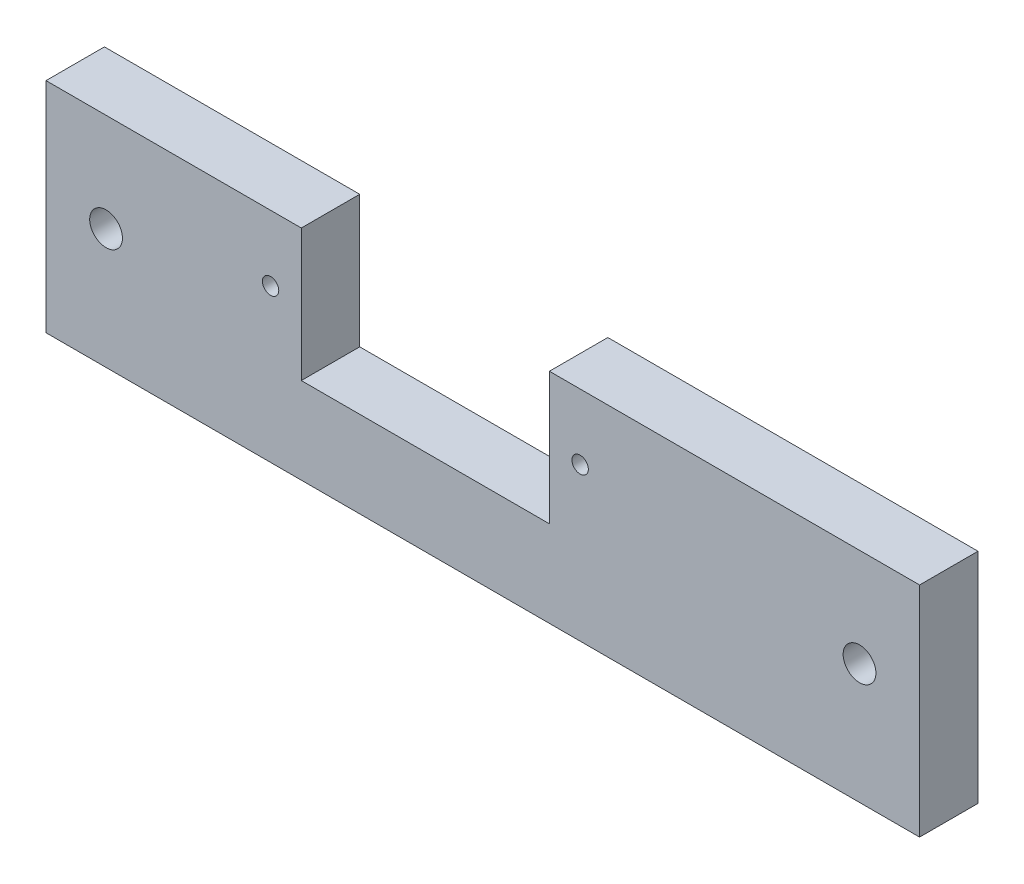
ISO-10303-21;
HEADER;
FILE_DESCRIPTION(('STEP AP214'),'2;1');
FILE_NAME('part.step','',(''),(''),'','','');
FILE_SCHEMA(('AUTOMOTIVE_DESIGN { 1 0 10303 214 1 1 1 1 }'));
ENDSEC;
DATA;
#1=APPLICATION_CONTEXT('core data for automotive mechanical design processes');
#2=APPLICATION_PROTOCOL_DEFINITION('international standard','automotive_design',2000,#1);
#3=PRODUCT_CONTEXT('',#1,'mechanical');
#4=PRODUCT('Part','Part','',(#3));
#5=PRODUCT_RELATED_PRODUCT_CATEGORY('part','',(#4));
#6=PRODUCT_DEFINITION_FORMATION('','',#4);
#7=PRODUCT_DEFINITION_CONTEXT('part definition',#1,'design');
#8=PRODUCT_DEFINITION('design','',#6,#7);
#9=PRODUCT_DEFINITION_SHAPE('','',#8);
#10=(LENGTH_UNIT() NAMED_UNIT(*) SI_UNIT(.MILLI.,.METRE.));
#11=(NAMED_UNIT(*) PLANE_ANGLE_UNIT() SI_UNIT($,.RADIAN.));
#12=(NAMED_UNIT(*) SI_UNIT($,.STERADIAN.) SOLID_ANGLE_UNIT());
#13=UNCERTAINTY_MEASURE_WITH_UNIT(LENGTH_MEASURE(1.E-05),#10,'distance_accuracy_value','');
#14=(GEOMETRIC_REPRESENTATION_CONTEXT(3) GLOBAL_UNCERTAINTY_ASSIGNED_CONTEXT((#13)) GLOBAL_UNIT_ASSIGNED_CONTEXT((#10,
#11,#12)) REPRESENTATION_CONTEXT('',''));
#15=CARTESIAN_POINT('',(0.,0.,0.));
#16=DIRECTION('',(0.,0.,1.));
#17=DIRECTION('',(1.,0.,0.));
#18=AXIS2_PLACEMENT_3D('',#15,#16,#17);
#19=CARTESIAN_POINT('',(0.,19.9999995529,5.35));
#20=DIRECTION('',(0.,1.,0.));
#21=DIRECTION('',(0.,0.,1.));
#22=AXIS2_PLACEMENT_3D('',#19,#20,#21);
#23=PLANE('',#22);
#24=DIRECTION('',(1.,0.,0.));
#25=VECTOR('',#24,1.);
#26=CARTESIAN_POINT('',(0.,19.9999995529,0.));
#27=LINE('',#26,#25);
#28=CARTESIAN_POINT('',(0.,19.9999995529,0.));
#29=VERTEX_POINT('',#28);
#30=CARTESIAN_POINT('',(23.3799982816,19.9999995529,0.));
#31=VERTEX_POINT('',#30);
#32=EDGE_CURVE('E151',#29,#31,#27,.T.);
#33=ORIENTED_EDGE('',*,*,#32,.F.);
#34=DIRECTION('',(0.,0.,-1.));
#35=VECTOR('',#34,1.);
#36=CARTESIAN_POINT('',(0.,19.9999995529,5.35));
#37=LINE('',#36,#35);
#38=CARTESIAN_POINT('',(0.,19.9999995529,5.35));
#39=VERTEX_POINT('',#38);
#40=EDGE_CURVE('E11',#39,#29,#37,.T.);
#41=ORIENTED_EDGE('',*,*,#40,.F.);
#42=DIRECTION('',(1.,0.,0.));
#43=VECTOR('',#42,1.);
#44=CARTESIAN_POINT('',(0.,19.9999995529,5.35));
#45=LINE('',#44,#43);
#46=CARTESIAN_POINT('',(23.3799982816,19.9999995529,5.35));
#47=VERTEX_POINT('',#46);
#48=EDGE_CURVE('E326',#39,#47,#45,.T.);
#49=ORIENTED_EDGE('',*,*,#48,.T.);
#50=DIRECTION('',(0.,0.,-1.));
#51=VECTOR('',#50,1.);
#52=CARTESIAN_POINT('',(23.3799982816,19.9999995529,5.35));
#53=LINE('',#52,#51);
#54=EDGE_CURVE('E86',#47,#31,#53,.T.);
#55=ORIENTED_EDGE('',*,*,#54,.T.);
#56=EDGE_LOOP('',(#33,#41,#49,#55));
#57=FACE_BOUND('',#56,.T.);
#58=ADVANCED_FACE('F35',(#57),#23,.T.);
#59=CARTESIAN_POINT('',(0.,0.,5.35));
#60=DIRECTION('',(-1.,0.,0.));
#61=DIRECTION('',(0.,0.,1.));
#62=AXIS2_PLACEMENT_3D('',#59,#60,#61);
#63=PLANE('',#62);
#64=DIRECTION('',(0.,1.,0.));
#65=VECTOR('',#64,1.);
#66=CARTESIAN_POINT('',(0.,0.,0.));
#67=LINE('',#66,#65);
#68=CARTESIAN_POINT('',(0.,0.,0.));
#69=VERTEX_POINT('',#68);
#70=EDGE_CURVE('E149',#69,#29,#67,.T.);
#71=ORIENTED_EDGE('',*,*,#70,.F.);
#72=DIRECTION('',(0.,0.,-1.));
#73=VECTOR('',#72,1.);
#74=CARTESIAN_POINT('',(0.,0.,5.35));
#75=LINE('',#74,#73);
#76=CARTESIAN_POINT('',(0.,0.,5.35));
#77=VERTEX_POINT('',#76);
#78=EDGE_CURVE('E44',#77,#69,#75,.T.);
#79=ORIENTED_EDGE('',*,*,#78,.F.);
#80=DIRECTION('',(0.,1.,0.));
#81=VECTOR('',#80,1.);
#82=CARTESIAN_POINT('',(0.,0.,5.35));
#83=LINE('',#82,#81);
#84=EDGE_CURVE('E324',#77,#39,#83,.T.);
#85=ORIENTED_EDGE('',*,*,#84,.T.);
#86=ORIENTED_EDGE('',*,*,#40,.T.);
#87=EDGE_LOOP('',(#71,#79,#85,#86));
#88=FACE_BOUND('',#87,.T.);
#89=ADVANCED_FACE('F150',(#88),#63,.T.);
#90=CARTESIAN_POINT('',(0.,0.,5.35));
#91=DIRECTION('',(0.,-1.,0.));
#92=DIRECTION('',(0.,0.,-1.));
#93=AXIS2_PLACEMENT_3D('',#90,#91,#92);
#94=PLANE('',#93);
#95=DIRECTION('',(-1.,0.,0.));
#96=VECTOR('',#95,1.);
#97=CARTESIAN_POINT('',(0.,0.,0.));
#98=LINE('',#97,#96);
#99=CARTESIAN_POINT('',(79.9999982119,0.,0.));
#100=VERTEX_POINT('',#99);
#101=EDGE_CURVE('E141',#100,#69,#98,.T.);
#102=ORIENTED_EDGE('',*,*,#101,.F.);
#103=DIRECTION('',(0.,0.,-1.));
#104=VECTOR('',#103,1.);
#105=CARTESIAN_POINT('',(79.9999982119,0.,5.35));
#106=LINE('',#105,#104);
#107=CARTESIAN_POINT('',(79.9999982119,0.,5.35));
#108=VERTEX_POINT('',#107);
#109=EDGE_CURVE('E134',#108,#100,#106,.T.);
#110=ORIENTED_EDGE('',*,*,#109,.F.);
#111=DIRECTION('',(-1.,0.,0.));
#112=VECTOR('',#111,1.);
#113=CARTESIAN_POINT('',(0.,0.,5.35));
#114=LINE('',#113,#112);
#115=EDGE_CURVE('E144',#108,#77,#114,.T.);
#116=ORIENTED_EDGE('',*,*,#115,.T.);
#117=ORIENTED_EDGE('',*,*,#78,.T.);
#118=EDGE_LOOP('',(#102,#110,#116,#117));
#119=FACE_BOUND('',#118,.T.);
#120=ADVANCED_FACE('F139',(#119),#94,.T.);
#121=CARTESIAN_POINT('',(79.9999982119,0.,5.35));
#122=DIRECTION('',(1.,0.,0.));
#123=DIRECTION('',(0.,0.,-1.));
#124=AXIS2_PLACEMENT_3D('',#121,#122,#123);
#125=PLANE('',#124);
#126=DIRECTION('',(0.,-1.,0.));
#127=VECTOR('',#126,1.);
#128=CARTESIAN_POINT('',(79.9999982119,0.,0.));
#129=LINE('',#128,#127);
#130=CARTESIAN_POINT('',(79.9999982119,19.9999995529,0.));
#131=VERTEX_POINT('',#130);
#132=EDGE_CURVE('E156',#131,#100,#129,.T.);
#133=ORIENTED_EDGE('',*,*,#132,.F.);
#134=DIRECTION('',(0.,0.,-1.));
#135=VECTOR('',#134,1.);
#136=CARTESIAN_POINT('',(79.9999982119,19.9999995529,5.35));
#137=LINE('',#136,#135);
#138=CARTESIAN_POINT('',(79.9999982119,19.9999995529,5.35));
#139=VERTEX_POINT('',#138);
#140=EDGE_CURVE('E128',#139,#131,#137,.T.);
#141=ORIENTED_EDGE('',*,*,#140,.F.);
#142=DIRECTION('',(0.,-1.,0.));
#143=VECTOR('',#142,1.);
#144=CARTESIAN_POINT('',(79.9999982119,0.,5.35));
#145=LINE('',#144,#143);
#146=EDGE_CURVE('E319',#139,#108,#145,.T.);
#147=ORIENTED_EDGE('',*,*,#146,.T.);
#148=ORIENTED_EDGE('',*,*,#109,.T.);
#149=EDGE_LOOP('',(#133,#141,#147,#148));
#150=FACE_BOUND('',#149,.T.);
#151=ADVANCED_FACE('F234',(#150),#125,.T.);
#152=CARTESIAN_POINT('',(0.,19.9999995529,5.35));
#153=DIRECTION('',(0.,1.,0.));
#154=DIRECTION('',(0.,0.,1.));
#155=AXIS2_PLACEMENT_3D('',#152,#153,#154);
#156=PLANE('',#155);
#157=DIRECTION('',(1.,0.,0.));
#158=VECTOR('',#157,1.);
#159=CARTESIAN_POINT('',(0.,19.9999995529,0.));
#160=LINE('',#159,#158);
#161=CARTESIAN_POINT('',(46.0999989882,19.9999995529,0.));
#162=VERTEX_POINT('',#161);
#163=EDGE_CURVE('E158',#162,#131,#160,.T.);
#164=ORIENTED_EDGE('',*,*,#163,.F.);
#165=DIRECTION('',(0.,0.,-1.));
#166=VECTOR('',#165,1.);
#167=CARTESIAN_POINT('',(46.0999989882,19.9999995529,5.35));
#168=LINE('',#167,#166);
#169=CARTESIAN_POINT('',(46.0999989882,19.9999995529,5.35));
#170=VERTEX_POINT('',#169);
#171=EDGE_CURVE('E126',#170,#162,#168,.T.);
#172=ORIENTED_EDGE('',*,*,#171,.F.);
#173=DIRECTION('',(1.,0.,0.));
#174=VECTOR('',#173,1.);
#175=CARTESIAN_POINT('',(0.,19.9999995529,5.35));
#176=LINE('',#175,#174);
#177=EDGE_CURVE('E120',#170,#139,#176,.T.);
#178=ORIENTED_EDGE('',*,*,#177,.T.);
#179=ORIENTED_EDGE('',*,*,#140,.T.);
#180=EDGE_LOOP('',(#164,#172,#178,#179));
#181=FACE_BOUND('',#180,.T.);
#182=ADVANCED_FACE('F231',(#181),#156,.T.);
#183=CARTESIAN_POINT('',(46.0999989882,0.,5.35));
#184=DIRECTION('',(1.,0.,0.));
#185=DIRECTION('',(0.,0.,-1.));
#186=AXIS2_PLACEMENT_3D('',#183,#184,#185);
#187=PLANE('',#186);
#188=DIRECTION('',(0.,-1.,0.));
#189=VECTOR('',#188,1.);
#190=CARTESIAN_POINT('',(46.0999989882,0.,0.));
#191=LINE('',#190,#189);
#192=CARTESIAN_POINT('',(46.0999989882,7.89999985129999,0.));
#193=VERTEX_POINT('',#192);
#194=EDGE_CURVE('E125',#162,#193,#191,.T.);
#195=ORIENTED_EDGE('',*,*,#194,.T.);
#196=DIRECTION('',(0.,0.,-1.));
#197=VECTOR('',#196,1.);
#198=CARTESIAN_POINT('',(46.0999989882,7.89999985129999,5.35));
#199=LINE('',#198,#197);
#200=CARTESIAN_POINT('',(46.0999989882,7.89999985129999,5.35));
#201=VERTEX_POINT('',#200);
#202=EDGE_CURVE('E110',#201,#193,#199,.T.);
#203=ORIENTED_EDGE('',*,*,#202,.F.);
#204=DIRECTION('',(0.,-1.,0.));
#205=VECTOR('',#204,1.);
#206=CARTESIAN_POINT('',(46.0999989882,0.,5.35));
#207=LINE('',#206,#205);
#208=EDGE_CURVE('E113',#170,#201,#207,.T.);
#209=ORIENTED_EDGE('',*,*,#208,.F.);
#210=ORIENTED_EDGE('',*,*,#171,.T.);
#211=EDGE_LOOP('',(#195,#203,#209,#210));
#212=FACE_BOUND('',#211,.T.);
#213=ADVANCED_FACE('F123',(#212),#187,.F.);
#214=CARTESIAN_POINT('',(0.,7.89999985129999,5.35));
#215=DIRECTION('',(0.,-1.,0.));
#216=DIRECTION('',(0.,0.,-1.));
#217=AXIS2_PLACEMENT_3D('',#214,#215,#216);
#218=PLANE('',#217);
#219=DIRECTION('',(-1.,0.,0.));
#220=VECTOR('',#219,1.);
#221=CARTESIAN_POINT('',(0.,7.89999985129999,0.));
#222=LINE('',#221,#220);
#223=CARTESIAN_POINT('',(23.3799982816,7.89999985129999,0.));
#224=VERTEX_POINT('',#223);
#225=EDGE_CURVE('E164',#193,#224,#222,.T.);
#226=ORIENTED_EDGE('',*,*,#225,.T.);
#227=DIRECTION('',(0.,0.,-1.));
#228=VECTOR('',#227,1.);
#229=CARTESIAN_POINT('',(23.3799982816,7.89999985129999,5.35));
#230=LINE('',#229,#228);
#231=CARTESIAN_POINT('',(23.3799982816,7.89999985129999,5.35));
#232=VERTEX_POINT('',#231);
#233=EDGE_CURVE('E112',#232,#224,#230,.T.);
#234=ORIENTED_EDGE('',*,*,#233,.F.);
#235=DIRECTION('',(-1.,0.,0.));
#236=VECTOR('',#235,1.);
#237=CARTESIAN_POINT('',(0.,7.89999985129999,5.35));
#238=LINE('',#237,#236);
#239=EDGE_CURVE('E105',#201,#232,#238,.T.);
#240=ORIENTED_EDGE('',*,*,#239,.F.);
#241=ORIENTED_EDGE('',*,*,#202,.T.);
#242=EDGE_LOOP('',(#226,#234,#240,#241));
#243=FACE_BOUND('',#242,.T.);
#244=ADVANCED_FACE('F108',(#243),#218,.F.);
#245=CARTESIAN_POINT('',(5.499999106,10.9999997764,5.35));
#246=DIRECTION('',(0.,0.,-1.));
#247=DIRECTION('',(-1.,0.,0.));
#248=AXIS2_PLACEMENT_3D('',#245,#246,#247);
#249=CYLINDRICAL_SURFACE('',#248,1.49999999999999);
#250=CARTESIAN_POINT('',(5.499999106,10.9999997764,5.35));
#251=DIRECTION('',(0.,0.,1.));
#252=DIRECTION('',(1.,0.,0.));
#253=AXIS2_PLACEMENT_3D('',#250,#251,#252);
#254=CIRCLE('',#253,1.49999999999999);
#255=CARTESIAN_POINT('',(6.99999910599999,10.9999997764,5.35));
#256=VERTEX_POINT('',#255);
#257=EDGE_CURVE('E328',#256,#256,#254,.T.);
#258=ORIENTED_EDGE('',*,*,#257,.T.);
#259=EDGE_LOOP('',(#258));
#260=FACE_BOUND('',#259,.T.);
#261=CARTESIAN_POINT('',(5.499999106,10.9999997764,0.));
#262=DIRECTION('',(0.,0.,1.));
#263=DIRECTION('',(1.,0.,0.));
#264=AXIS2_PLACEMENT_3D('',#261,#262,#263);
#265=CIRCLE('',#264,1.49999999999999);
#266=CARTESIAN_POINT('',(6.99999910599999,10.9999997764,0.));
#267=VERTEX_POINT('',#266);
#268=EDGE_CURVE('E178',#267,#267,#265,.T.);
#269=ORIENTED_EDGE('',*,*,#268,.F.);
#270=EDGE_LOOP('',(#269));
#271=FACE_BOUND('',#270,.T.);
#272=ADVANCED_FACE('F188',(#260,#271),#249,.F.);
#273=CARTESIAN_POINT('',(74.499999106,10.9999997764,5.35));
#274=DIRECTION('',(0.,0.,-1.));
#275=DIRECTION('',(-1.,0.,0.));
#276=AXIS2_PLACEMENT_3D('',#273,#274,#275);
#277=CYLINDRICAL_SURFACE('',#276,1.5);
#278=CARTESIAN_POINT('',(74.499999106,10.9999997764,5.35));
#279=DIRECTION('',(0.,0.,1.));
#280=DIRECTION('',(1.,0.,0.));
#281=AXIS2_PLACEMENT_3D('',#278,#279,#280);
#282=CIRCLE('',#281,1.5);
#283=CARTESIAN_POINT('',(75.999999106,10.9999997764,5.35));
#284=VERTEX_POINT('',#283);
#285=EDGE_CURVE('E331',#284,#284,#282,.T.);
#286=ORIENTED_EDGE('',*,*,#285,.T.);
#287=EDGE_LOOP('',(#286));
#288=FACE_BOUND('',#287,.T.);
#289=CARTESIAN_POINT('',(74.499999106,10.9999997764,0.));
#290=DIRECTION('',(0.,0.,1.));
#291=DIRECTION('',(1.,0.,0.));
#292=AXIS2_PLACEMENT_3D('',#289,#290,#291);
#293=CIRCLE('',#292,1.5);
#294=CARTESIAN_POINT('',(75.999999106,10.9999997764,0.));
#295=VERTEX_POINT('',#294);
#296=EDGE_CURVE('E175',#295,#295,#293,.T.);
#297=ORIENTED_EDGE('',*,*,#296,.F.);
#298=EDGE_LOOP('',(#297));
#299=FACE_BOUND('',#298,.T.);
#300=ADVANCED_FACE('F191',(#288,#299),#277,.F.);
#301=CARTESIAN_POINT('',(20.566323943,13.9999997764,5.35));
#302=DIRECTION('',(0.,0.,-1.));
#303=DIRECTION('',(-1.,0.,0.));
#304=AXIS2_PLACEMENT_3D('',#301,#302,#303);
#305=CYLINDRICAL_SURFACE('',#304,0.750000000000002);
#306=CARTESIAN_POINT('',(20.566323943,13.9999997764,5.35));
#307=DIRECTION('',(0.,0.,1.));
#308=DIRECTION('',(1.,0.,0.));
#309=AXIS2_PLACEMENT_3D('',#306,#307,#308);
#310=CIRCLE('',#309,0.750000000000002);
#311=CARTESIAN_POINT('',(21.316323943,13.9999997764,5.35));
#312=VERTEX_POINT('',#311);
#313=EDGE_CURVE('E206',#312,#312,#310,.T.);
#314=ORIENTED_EDGE('',*,*,#313,.T.);
#315=EDGE_LOOP('',(#314));
#316=FACE_BOUND('',#315,.T.);
#317=CARTESIAN_POINT('',(20.566323943,13.9999997764,0.));
#318=DIRECTION('',(0.,0.,1.));
#319=DIRECTION('',(1.,0.,0.));
#320=AXIS2_PLACEMENT_3D('',#317,#318,#319);
#321=CIRCLE('',#320,0.750000000000002);
#322=CARTESIAN_POINT('',(21.316323943,13.9999997764,0.));
#323=VERTEX_POINT('',#322);
#324=EDGE_CURVE('E172',#323,#323,#321,.T.);
#325=ORIENTED_EDGE('',*,*,#324,.F.);
#326=EDGE_LOOP('',(#325));
#327=FACE_BOUND('',#326,.T.);
#328=ADVANCED_FACE('F194',(#316,#327),#305,.F.);
#329=CARTESIAN_POINT('',(48.9136742689,13.9999997764,5.35));
#330=DIRECTION('',(0.,0.,-1.));
#331=DIRECTION('',(-1.,0.,0.));
#332=AXIS2_PLACEMENT_3D('',#329,#330,#331);
#333=CYLINDRICAL_SURFACE('',#332,0.749999999999999);
#334=CARTESIAN_POINT('',(48.9136742689,13.9999997764,5.35));
#335=DIRECTION('',(0.,0.,1.));
#336=DIRECTION('',(1.,0.,0.));
#337=AXIS2_PLACEMENT_3D('',#334,#335,#336);
#338=CIRCLE('',#337,0.749999999999999);
#339=CARTESIAN_POINT('',(49.6636742689,13.9999997764,5.35));
#340=VERTEX_POINT('',#339);
#341=EDGE_CURVE('E166',#340,#340,#338,.T.);
#342=ORIENTED_EDGE('',*,*,#341,.T.);
#343=EDGE_LOOP('',(#342));
#344=FACE_BOUND('',#343,.T.);
#345=CARTESIAN_POINT('',(48.9136742689,13.9999997764,0.));
#346=DIRECTION('',(0.,0.,1.));
#347=DIRECTION('',(1.,0.,0.));
#348=AXIS2_PLACEMENT_3D('',#345,#346,#347);
#349=CIRCLE('',#348,0.749999999999999);
#350=CARTESIAN_POINT('',(49.6636742689,13.9999997764,0.));
#351=VERTEX_POINT('',#350);
#352=EDGE_CURVE('E169',#351,#351,#349,.T.);
#353=ORIENTED_EDGE('',*,*,#352,.F.);
#354=EDGE_LOOP('',(#353));
#355=FACE_BOUND('',#354,.T.);
#356=ADVANCED_FACE('F37',(#344,#355),#333,.F.);
#357=CARTESIAN_POINT('',(23.3799982816,0.,5.35));
#358=DIRECTION('',(-1.,0.,0.));
#359=DIRECTION('',(0.,0.,1.));
#360=AXIS2_PLACEMENT_3D('',#357,#358,#359);
#361=PLANE('',#360);
#362=DIRECTION('',(0.,1.,0.));
#363=VECTOR('',#362,1.);
#364=CARTESIAN_POINT('',(23.3799982816,0.,0.));
#365=LINE('',#364,#363);
#366=EDGE_CURVE('E79',#224,#31,#365,.T.);
#367=ORIENTED_EDGE('',*,*,#366,.T.);
#368=ORIENTED_EDGE('',*,*,#54,.F.);
#369=DIRECTION('',(0.,1.,0.));
#370=VECTOR('',#369,1.);
#371=CARTESIAN_POINT('',(23.3799982816,0.,5.35));
#372=LINE('',#371,#370);
#373=EDGE_CURVE('E52',#232,#47,#372,.T.);
#374=ORIENTED_EDGE('',*,*,#373,.F.);
#375=ORIENTED_EDGE('',*,*,#233,.T.);
#376=EDGE_LOOP('',(#367,#368,#374,#375));
#377=FACE_BOUND('',#376,.T.);
#378=ADVANCED_FACE('F201',(#377),#361,.F.);
#379=CARTESIAN_POINT('',(0.,0.,5.35));
#380=DIRECTION('',(0.,0.,1.));
#381=DIRECTION('',(1.,0.,0.));
#382=AXIS2_PLACEMENT_3D('',#379,#380,#381);
#383=PLANE('',#382);
#384=ORIENTED_EDGE('',*,*,#341,.F.);
#385=EDGE_LOOP('',(#384));
#386=FACE_BOUND('',#385,.T.);
#387=ORIENTED_EDGE('',*,*,#313,.F.);
#388=EDGE_LOOP('',(#387));
#389=FACE_BOUND('',#388,.T.);
#390=ORIENTED_EDGE('',*,*,#285,.F.);
#391=EDGE_LOOP('',(#390));
#392=FACE_BOUND('',#391,.T.);
#393=ORIENTED_EDGE('',*,*,#257,.F.);
#394=EDGE_LOOP('',(#393));
#395=FACE_BOUND('',#394,.T.);
#396=ORIENTED_EDGE('',*,*,#48,.F.);
#397=ORIENTED_EDGE('',*,*,#84,.F.);
#398=ORIENTED_EDGE('',*,*,#115,.F.);
#399=ORIENTED_EDGE('',*,*,#146,.F.);
#400=ORIENTED_EDGE('',*,*,#177,.F.);
#401=ORIENTED_EDGE('',*,*,#208,.T.);
#402=ORIENTED_EDGE('',*,*,#239,.T.);
#403=ORIENTED_EDGE('',*,*,#373,.T.);
#404=EDGE_LOOP('',(#396,#397,#398,#399,#400,#401,#402,#403));
#405=FACE_BOUND('',#404,.T.);
#406=ADVANCED_FACE('F117',(#386,#389,#392,#395,#405),#383,.T.);
#407=CARTESIAN_POINT('',(0.,0.,0.));
#408=DIRECTION('',(0.,0.,1.));
#409=DIRECTION('',(1.,0.,0.));
#410=AXIS2_PLACEMENT_3D('',#407,#408,#409);
#411=PLANE('',#410);
#412=ORIENTED_EDGE('',*,*,#352,.T.);
#413=EDGE_LOOP('',(#412));
#414=FACE_BOUND('',#413,.T.);
#415=ORIENTED_EDGE('',*,*,#324,.T.);
#416=EDGE_LOOP('',(#415));
#417=FACE_BOUND('',#416,.T.);
#418=ORIENTED_EDGE('',*,*,#296,.T.);
#419=EDGE_LOOP('',(#418));
#420=FACE_BOUND('',#419,.T.);
#421=ORIENTED_EDGE('',*,*,#268,.T.);
#422=EDGE_LOOP('',(#421));
#423=FACE_BOUND('',#422,.T.);
#424=ORIENTED_EDGE('',*,*,#32,.T.);
#425=ORIENTED_EDGE('',*,*,#366,.F.);
#426=ORIENTED_EDGE('',*,*,#225,.F.);
#427=ORIENTED_EDGE('',*,*,#194,.F.);
#428=ORIENTED_EDGE('',*,*,#163,.T.);
#429=ORIENTED_EDGE('',*,*,#132,.T.);
#430=ORIENTED_EDGE('',*,*,#101,.T.);
#431=ORIENTED_EDGE('',*,*,#70,.T.);
#432=EDGE_LOOP('',(#424,#425,#426,#427,#428,#429,#430,#431));
#433=FACE_BOUND('',#432,.T.);
#434=ADVANCED_FACE('F153',(#414,#417,#420,#423,#433),#411,.F.);
#435=CLOSED_SHELL('',(#58,#89,#120,#151,#182,#213,#244,#272,#300,#328,#356,#378,#406,#434));
#436=MANIFOLD_SOLID_BREP('B2',#435);
#437=ADVANCED_BREP_SHAPE_REPRESENTATION('',(#18,#436),#14);
#438=SHAPE_DEFINITION_REPRESENTATION(#9,#437);
ENDSEC;
END-ISO-10303-21;
